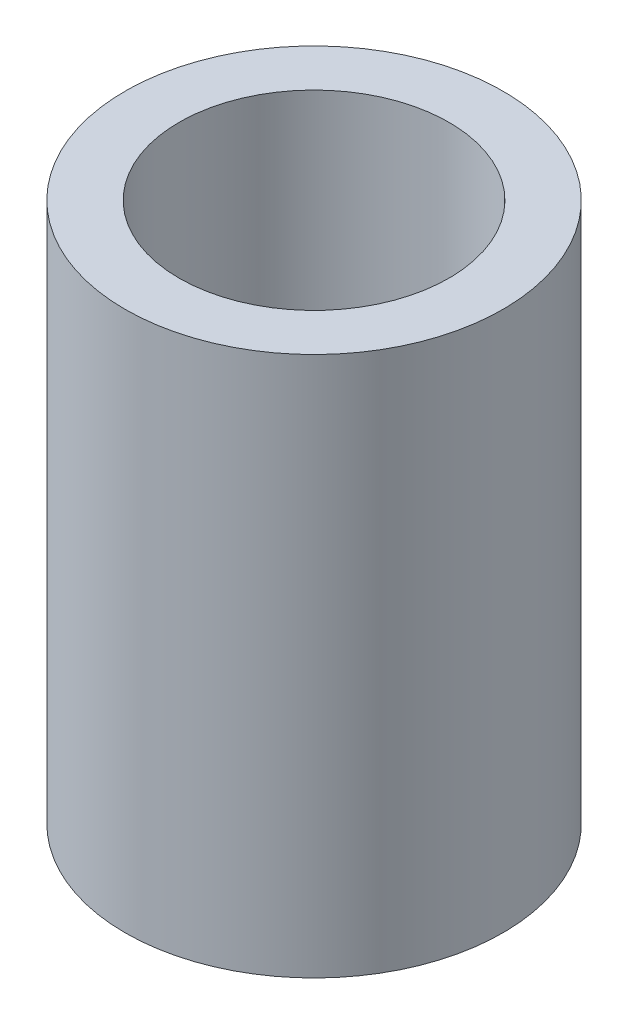
ISO-10303-21;
HEADER;
FILE_DESCRIPTION(('STEP AP214'),'2;1');
FILE_NAME('part.step','',(''),(''),'','','');
FILE_SCHEMA(('AUTOMOTIVE_DESIGN { 1 0 10303 214 1 1 1 1 }'));
ENDSEC;
DATA;
#1=APPLICATION_CONTEXT('core data for automotive mechanical design processes');
#2=APPLICATION_PROTOCOL_DEFINITION('international standard','automotive_design',2000,#1);
#3=PRODUCT_CONTEXT('',#1,'mechanical');
#4=PRODUCT('Part','Part','',(#3));
#5=PRODUCT_RELATED_PRODUCT_CATEGORY('part','',(#4));
#6=PRODUCT_DEFINITION_FORMATION('','',#4);
#7=PRODUCT_DEFINITION_CONTEXT('part definition',#1,'design');
#8=PRODUCT_DEFINITION('design','',#6,#7);
#9=PRODUCT_DEFINITION_SHAPE('','',#8);
#10=(LENGTH_UNIT() NAMED_UNIT(*) SI_UNIT(.MILLI.,.METRE.));
#11=(NAMED_UNIT(*) PLANE_ANGLE_UNIT() SI_UNIT($,.RADIAN.));
#12=(NAMED_UNIT(*) SI_UNIT($,.STERADIAN.) SOLID_ANGLE_UNIT());
#13=UNCERTAINTY_MEASURE_WITH_UNIT(LENGTH_MEASURE(1.E-05),#10,'distance_accuracy_value','');
#14=(GEOMETRIC_REPRESENTATION_CONTEXT(3) GLOBAL_UNCERTAINTY_ASSIGNED_CONTEXT((#13)) GLOBAL_UNIT_ASSIGNED_CONTEXT((#10,
#11,#12)) REPRESENTATION_CONTEXT('',''));
#15=CARTESIAN_POINT('',(0.,0.,0.));
#16=DIRECTION('',(0.,0.,1.));
#17=DIRECTION('',(1.,0.,0.));
#18=AXIS2_PLACEMENT_3D('',#15,#16,#17);
#19=CARTESIAN_POINT('',(0.,3.,0.));
#20=DIRECTION('',(0.,1.,0.));
#21=DIRECTION('',(0.,0.,1.));
#22=AXIS2_PLACEMENT_3D('',#19,#20,#21);
#23=PLANE('',#22);
#24=CARTESIAN_POINT('',(0.,3.,0.));
#25=DIRECTION('',(0.,1.,0.));
#26=DIRECTION('',(0.,0.,1.));
#27=AXIS2_PLACEMENT_3D('',#24,#25,#26);
#28=CIRCLE('',#27,2.1);
#29=CARTESIAN_POINT('',(0.,3.,2.1));
#30=VERTEX_POINT('',#29);
#31=EDGE_CURVE('E10',#30,#30,#28,.T.);
#32=ORIENTED_EDGE('',*,*,#31,.T.);
#33=EDGE_LOOP('',(#32));
#34=FACE_BOUND('',#33,.T.);
#35=CARTESIAN_POINT('',(0.,3.,0.));
#36=DIRECTION('',(0.,1.,0.));
#37=DIRECTION('',(0.,0.,1.));
#38=AXIS2_PLACEMENT_3D('',#35,#36,#37);
#39=CIRCLE('',#38,1.5);
#40=CARTESIAN_POINT('',(0.,3.,1.5));
#41=VERTEX_POINT('',#40);
#42=EDGE_CURVE('E56',#41,#41,#39,.T.);
#43=ORIENTED_EDGE('',*,*,#42,.F.);
#44=EDGE_LOOP('',(#43));
#45=FACE_BOUND('',#44,.T.);
#46=ADVANCED_FACE('F43',(#34,#45),#23,.T.);
#47=CARTESIAN_POINT('',(0.,-3.,0.));
#48=DIRECTION('',(0.,1.,0.));
#49=DIRECTION('',(0.,0.,1.));
#50=AXIS2_PLACEMENT_3D('',#47,#48,#49);
#51=PLANE('',#50);
#52=CARTESIAN_POINT('',(0.,-3.,0.));
#53=DIRECTION('',(0.,1.,0.));
#54=DIRECTION('',(0.,0.,1.));
#55=AXIS2_PLACEMENT_3D('',#52,#53,#54);
#56=CIRCLE('',#55,2.1);
#57=CARTESIAN_POINT('',(0.,-3.,2.1));
#58=VERTEX_POINT('',#57);
#59=EDGE_CURVE('E47',#58,#58,#56,.T.);
#60=ORIENTED_EDGE('',*,*,#59,.F.);
#61=EDGE_LOOP('',(#60));
#62=FACE_BOUND('',#61,.T.);
#63=CARTESIAN_POINT('',(0.,-3.,0.));
#64=DIRECTION('',(0.,1.,0.));
#65=DIRECTION('',(0.,0.,1.));
#66=AXIS2_PLACEMENT_3D('',#63,#64,#65);
#67=CIRCLE('',#66,1.5);
#68=CARTESIAN_POINT('',(0.,-3.,1.5));
#69=VERTEX_POINT('',#68);
#70=EDGE_CURVE('E58',#69,#69,#67,.T.);
#71=ORIENTED_EDGE('',*,*,#70,.T.);
#72=EDGE_LOOP('',(#71));
#73=FACE_BOUND('',#72,.T.);
#74=ADVANCED_FACE('F70',(#62,#73),#51,.F.);
#75=CARTESIAN_POINT('',(0.,3.,0.));
#76=DIRECTION('',(0.,-1.,0.));
#77=DIRECTION('',(0.,0.,-1.));
#78=AXIS2_PLACEMENT_3D('',#75,#76,#77);
#79=CYLINDRICAL_SURFACE('',#78,2.1);
#80=ORIENTED_EDGE('',*,*,#31,.F.);
#81=EDGE_LOOP('',(#80));
#82=FACE_BOUND('',#81,.T.);
#83=ORIENTED_EDGE('',*,*,#59,.T.);
#84=EDGE_LOOP('',(#83));
#85=FACE_BOUND('',#84,.T.);
#86=ADVANCED_FACE('F45',(#82,#85),#79,.T.);
#87=CARTESIAN_POINT('',(0.,3.,0.));
#88=DIRECTION('',(0.,-1.,0.));
#89=DIRECTION('',(0.,0.,-1.));
#90=AXIS2_PLACEMENT_3D('',#87,#88,#89);
#91=CYLINDRICAL_SURFACE('',#90,1.5);
#92=ORIENTED_EDGE('',*,*,#42,.T.);
#93=EDGE_LOOP('',(#92));
#94=FACE_BOUND('',#93,.T.);
#95=ORIENTED_EDGE('',*,*,#70,.F.);
#96=EDGE_LOOP('',(#95));
#97=FACE_BOUND('',#96,.T.);
#98=ADVANCED_FACE('F66',(#94,#97),#91,.F.);
#99=CLOSED_SHELL('',(#46,#74,#86,#98));
#100=MANIFOLD_SOLID_BREP('B2',#99);
#101=ADVANCED_BREP_SHAPE_REPRESENTATION('',(#18,#100),#14);
#102=SHAPE_DEFINITION_REPRESENTATION(#9,#101);
ENDSEC;
END-ISO-10303-21;
